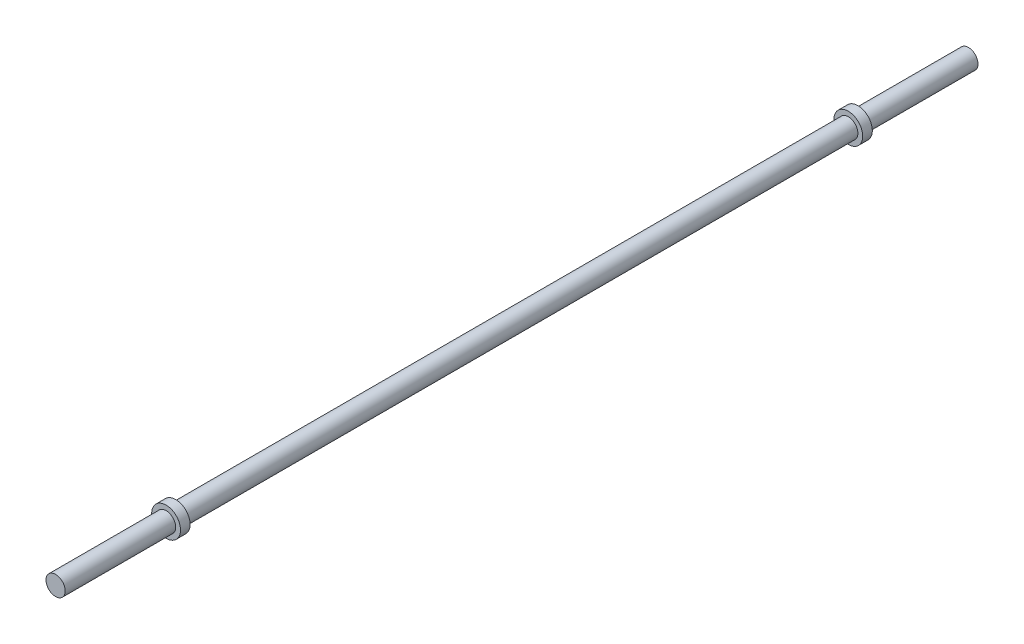
ISO-10303-21;
HEADER;
FILE_DESCRIPTION(('STEP AP214'),'2;1');
FILE_NAME('part.step','',(''),(''),'','','');
FILE_SCHEMA(('AUTOMOTIVE_DESIGN { 1 0 10303 214 1 1 1 1 }'));
ENDSEC;
DATA;
#1=APPLICATION_CONTEXT('core data for automotive mechanical design processes');
#2=APPLICATION_PROTOCOL_DEFINITION('international standard','automotive_design',2000,#1);
#3=PRODUCT_CONTEXT('',#1,'mechanical');
#4=PRODUCT('Part','Part','',(#3));
#5=PRODUCT_RELATED_PRODUCT_CATEGORY('part','',(#4));
#6=PRODUCT_DEFINITION_FORMATION('','',#4);
#7=PRODUCT_DEFINITION_CONTEXT('part definition',#1,'design');
#8=PRODUCT_DEFINITION('design','',#6,#7);
#9=PRODUCT_DEFINITION_SHAPE('','',#8);
#10=(LENGTH_UNIT() NAMED_UNIT(*) SI_UNIT(.MILLI.,.METRE.));
#11=(NAMED_UNIT(*) PLANE_ANGLE_UNIT() SI_UNIT($,.RADIAN.));
#12=(NAMED_UNIT(*) SI_UNIT($,.STERADIAN.) SOLID_ANGLE_UNIT());
#13=UNCERTAINTY_MEASURE_WITH_UNIT(LENGTH_MEASURE(1.E-05),#10,'distance_accuracy_value','');
#14=(GEOMETRIC_REPRESENTATION_CONTEXT(3) GLOBAL_UNCERTAINTY_ASSIGNED_CONTEXT((#13)) GLOBAL_UNIT_ASSIGNED_CONTEXT((#10,
#11,#12)) REPRESENTATION_CONTEXT('',''));
#15=CARTESIAN_POINT('',(0.,0.,0.));
#16=DIRECTION('',(0.,0.,1.));
#17=DIRECTION('',(1.,0.,0.));
#18=AXIS2_PLACEMENT_3D('',#15,#16,#17);
#19=CARTESIAN_POINT('',(0.,0.,-95.));
#20=DIRECTION('',(0.,0.,1.));
#21=DIRECTION('',(1.,0.,0.));
#22=AXIS2_PLACEMENT_3D('',#19,#20,#21);
#23=CYLINDRICAL_SURFACE('',#22,1.);
#24=CARTESIAN_POINT('',(0.,0.,-12.5));
#25=DIRECTION('',(0.,0.,1.));
#26=DIRECTION('',(1.,0.,0.));
#27=AXIS2_PLACEMENT_3D('',#24,#25,#26);
#28=CIRCLE('',#27,1.);
#29=CARTESIAN_POINT('',(1.,0.,-12.5));
#30=VERTEX_POINT('',#29);
#31=EDGE_CURVE('E49',#30,#30,#28,.F.);
#32=ORIENTED_EDGE('',*,*,#31,.T.);
#33=EDGE_LOOP('',(#32));
#34=FACE_BOUND('',#33,.T.);
#35=CARTESIAN_POINT('',(0.,0.,-82.5));
#36=DIRECTION('',(0.,0.,-1.));
#37=DIRECTION('',(-1.,0.,0.));
#38=AXIS2_PLACEMENT_3D('',#35,#36,#37);
#39=CIRCLE('',#38,1.);
#40=CARTESIAN_POINT('',(-1.,0.,-82.5));
#41=VERTEX_POINT('',#40);
#42=EDGE_CURVE('E51',#41,#41,#39,.F.);
#43=ORIENTED_EDGE('',*,*,#42,.T.);
#44=EDGE_LOOP('',(#43));
#45=FACE_BOUND('',#44,.T.);
#46=ADVANCED_FACE('F30',(#34,#45),#23,.T.);
#47=CARTESIAN_POINT('',(0.,0.,-11.5));
#48=DIRECTION('',(0.,0.,1.));
#49=DIRECTION('',(1.,0.,0.));
#50=AXIS2_PLACEMENT_3D('',#47,#48,#49);
#51=CIRCLE('',#50,1.);
#52=CARTESIAN_POINT('',(1.,0.,-11.5));
#53=VERTEX_POINT('',#52);
#54=EDGE_CURVE('E37',#53,#53,#51,.F.);
#55=ORIENTED_EDGE('',*,*,#54,.F.);
#56=EDGE_LOOP('',(#55));
#57=FACE_BOUND('',#56,.T.);
#58=CARTESIAN_POINT('',(0.,0.,0.));
#59=DIRECTION('',(0.,0.,1.));
#60=DIRECTION('',(1.,0.,0.));
#61=AXIS2_PLACEMENT_3D('',#58,#59,#60);
#62=CIRCLE('',#61,1.);
#63=CARTESIAN_POINT('',(1.,0.,0.));
#64=VERTEX_POINT('',#63);
#65=EDGE_CURVE('E46',#64,#64,#62,.T.);
#66=ORIENTED_EDGE('',*,*,#65,.F.);
#67=EDGE_LOOP('',(#66));
#68=FACE_BOUND('',#67,.T.);
#69=ADVANCED_FACE('F32',(#57,#68),#23,.T.);
#70=CARTESIAN_POINT('',(0.,0.,0.));
#71=DIRECTION('',(0.,0.,1.));
#72=DIRECTION('',(1.,0.,0.));
#73=AXIS2_PLACEMENT_3D('',#70,#71,#72);
#74=PLANE('',#73);
#75=ORIENTED_EDGE('',*,*,#65,.T.);
#76=EDGE_LOOP('',(#75));
#77=FACE_BOUND('',#76,.T.);
#78=ADVANCED_FACE('F86',(#77),#74,.T.);
#79=CARTESIAN_POINT('',(0.,0.,-11.5));
#80=DIRECTION('',(0.,0.,-1.));
#81=DIRECTION('',(-1.,0.,0.));
#82=AXIS2_PLACEMENT_3D('',#79,#80,#81);
#83=CYLINDRICAL_SURFACE('',#82,1.5);
#84=CARTESIAN_POINT('',(0.,0.,-11.5));
#85=DIRECTION('',(0.,0.,1.));
#86=DIRECTION('',(1.,0.,0.));
#87=AXIS2_PLACEMENT_3D('',#84,#85,#86);
#88=CIRCLE('',#87,1.5);
#89=CARTESIAN_POINT('',(1.5,0.,-11.5));
#90=VERTEX_POINT('',#89);
#91=EDGE_CURVE('E58',#90,#90,#88,.T.);
#92=ORIENTED_EDGE('',*,*,#91,.F.);
#93=EDGE_LOOP('',(#92));
#94=FACE_BOUND('',#93,.T.);
#95=CARTESIAN_POINT('',(0.,0.,-12.5));
#96=DIRECTION('',(0.,0.,1.));
#97=DIRECTION('',(1.,0.,0.));
#98=AXIS2_PLACEMENT_3D('',#95,#96,#97);
#99=CIRCLE('',#98,1.5);
#100=CARTESIAN_POINT('',(1.5,0.,-12.5));
#101=VERTEX_POINT('',#100);
#102=EDGE_CURVE('E53',#101,#101,#99,.T.);
#103=ORIENTED_EDGE('',*,*,#102,.T.);
#104=EDGE_LOOP('',(#103));
#105=FACE_BOUND('',#104,.T.);
#106=ADVANCED_FACE('F84',(#94,#105),#83,.T.);
#107=CARTESIAN_POINT('',(0.,0.,-11.5));
#108=DIRECTION('',(0.,0.,1.));
#109=DIRECTION('',(1.,0.,0.));
#110=AXIS2_PLACEMENT_3D('',#107,#108,#109);
#111=PLANE('',#110);
#112=ORIENTED_EDGE('',*,*,#54,.T.);
#113=EDGE_LOOP('',(#112));
#114=FACE_BOUND('',#113,.T.);
#115=ORIENTED_EDGE('',*,*,#91,.T.);
#116=EDGE_LOOP('',(#115));
#117=FACE_BOUND('',#116,.T.);
#118=ADVANCED_FACE('F80',(#114,#117),#111,.T.);
#119=CARTESIAN_POINT('',(0.,0.,-12.5));
#120=DIRECTION('',(0.,0.,1.));
#121=DIRECTION('',(1.,0.,0.));
#122=AXIS2_PLACEMENT_3D('',#119,#120,#121);
#123=PLANE('',#122);
#124=ORIENTED_EDGE('',*,*,#31,.F.);
#125=EDGE_LOOP('',(#124));
#126=FACE_BOUND('',#125,.T.);
#127=ORIENTED_EDGE('',*,*,#102,.F.);
#128=EDGE_LOOP('',(#127));
#129=FACE_BOUND('',#128,.T.);
#130=ADVANCED_FACE('F76',(#126,#129),#123,.F.);
#131=CARTESIAN_POINT('',(0.,0.,-83.5));
#132=DIRECTION('',(0.,0.,1.));
#133=DIRECTION('',(1.,0.,0.));
#134=AXIS2_PLACEMENT_3D('',#131,#132,#133);
#135=CYLINDRICAL_SURFACE('',#134,1.5);
#136=CARTESIAN_POINT('',(0.,0.,-83.5));
#137=DIRECTION('',(0.,0.,-1.));
#138=DIRECTION('',(-1.,0.,0.));
#139=AXIS2_PLACEMENT_3D('',#136,#137,#138);
#140=CIRCLE('',#139,1.5);
#141=CARTESIAN_POINT('',(-1.5,0.,-83.5));
#142=VERTEX_POINT('',#141);
#143=EDGE_CURVE('E54',#142,#142,#140,.T.);
#144=ORIENTED_EDGE('',*,*,#143,.F.);
#145=EDGE_LOOP('',(#144));
#146=FACE_BOUND('',#145,.T.);
#147=CARTESIAN_POINT('',(0.,0.,-82.5));
#148=DIRECTION('',(0.,0.,-1.));
#149=DIRECTION('',(-1.,0.,0.));
#150=AXIS2_PLACEMENT_3D('',#147,#148,#149);
#151=CIRCLE('',#150,1.5);
#152=CARTESIAN_POINT('',(-1.5,0.,-82.5));
#153=VERTEX_POINT('',#152);
#154=EDGE_CURVE('E61',#153,#153,#151,.T.);
#155=ORIENTED_EDGE('',*,*,#154,.T.);
#156=EDGE_LOOP('',(#155));
#157=FACE_BOUND('',#156,.T.);
#158=ADVANCED_FACE('F79',(#146,#157),#135,.T.);
#159=CARTESIAN_POINT('',(0.,0.,-83.5));
#160=DIRECTION('',(0.,0.,-1.));
#161=DIRECTION('',(-1.,0.,0.));
#162=AXIS2_PLACEMENT_3D('',#159,#160,#161);
#163=PLANE('',#162);
#164=CARTESIAN_POINT('',(0.,0.,-83.5));
#165=DIRECTION('',(0.,0.,-1.));
#166=DIRECTION('',(-1.,0.,0.));
#167=AXIS2_PLACEMENT_3D('',#164,#165,#166);
#168=CIRCLE('',#167,1.);
#169=CARTESIAN_POINT('',(-1.,0.,-83.5));
#170=VERTEX_POINT('',#169);
#171=EDGE_CURVE('E10',#170,#170,#168,.F.);
#172=ORIENTED_EDGE('',*,*,#171,.T.);
#173=EDGE_LOOP('',(#172));
#174=FACE_BOUND('',#173,.T.);
#175=ORIENTED_EDGE('',*,*,#143,.T.);
#176=EDGE_LOOP('',(#175));
#177=FACE_BOUND('',#176,.T.);
#178=ADVANCED_FACE('F115',(#174,#177),#163,.T.);
#179=CARTESIAN_POINT('',(0.,0.,-82.5));
#180=DIRECTION('',(0.,0.,-1.));
#181=DIRECTION('',(-1.,0.,0.));
#182=AXIS2_PLACEMENT_3D('',#179,#180,#181);
#183=PLANE('',#182);
#184=ORIENTED_EDGE('',*,*,#42,.F.);
#185=EDGE_LOOP('',(#184));
#186=FACE_BOUND('',#185,.T.);
#187=ORIENTED_EDGE('',*,*,#154,.F.);
#188=EDGE_LOOP('',(#187));
#189=FACE_BOUND('',#188,.T.);
#190=ADVANCED_FACE('F108',(#186,#189),#183,.F.);
#191=CARTESIAN_POINT('',(0.,0.,-95.));
#192=DIRECTION('',(0.,0.,1.));
#193=DIRECTION('',(1.,0.,0.));
#194=AXIS2_PLACEMENT_3D('',#191,#192,#193);
#195=PLANE('',#194);
#196=CARTESIAN_POINT('',(0.,0.,-95.));
#197=DIRECTION('',(0.,0.,1.));
#198=DIRECTION('',(1.,0.,0.));
#199=AXIS2_PLACEMENT_3D('',#196,#197,#198);
#200=CIRCLE('',#199,1.);
#201=CARTESIAN_POINT('',(1.,0.,-95.));
#202=VERTEX_POINT('',#201);
#203=EDGE_CURVE('E41',#202,#202,#200,.T.);
#204=ORIENTED_EDGE('',*,*,#203,.F.);
#205=EDGE_LOOP('',(#204));
#206=FACE_BOUND('',#205,.T.);
#207=ADVANCED_FACE('F103',(#206),#195,.F.);
#208=ORIENTED_EDGE('',*,*,#171,.F.);
#209=EDGE_LOOP('',(#208));
#210=FACE_BOUND('',#209,.T.);
#211=ORIENTED_EDGE('',*,*,#203,.T.);
#212=EDGE_LOOP('',(#211));
#213=FACE_BOUND('',#212,.T.);
#214=ADVANCED_FACE('F97',(#210,#213),#23,.T.);
#215=CLOSED_SHELL('',(#46,#69,#78,#106,#118,#130,#158,#178,#190,#207,#214));
#216=MANIFOLD_SOLID_BREP('B2',#215);
#217=ADVANCED_BREP_SHAPE_REPRESENTATION('',(#18,#216),#14);
#218=SHAPE_DEFINITION_REPRESENTATION(#9,#217);
ENDSEC;
END-ISO-10303-21;
